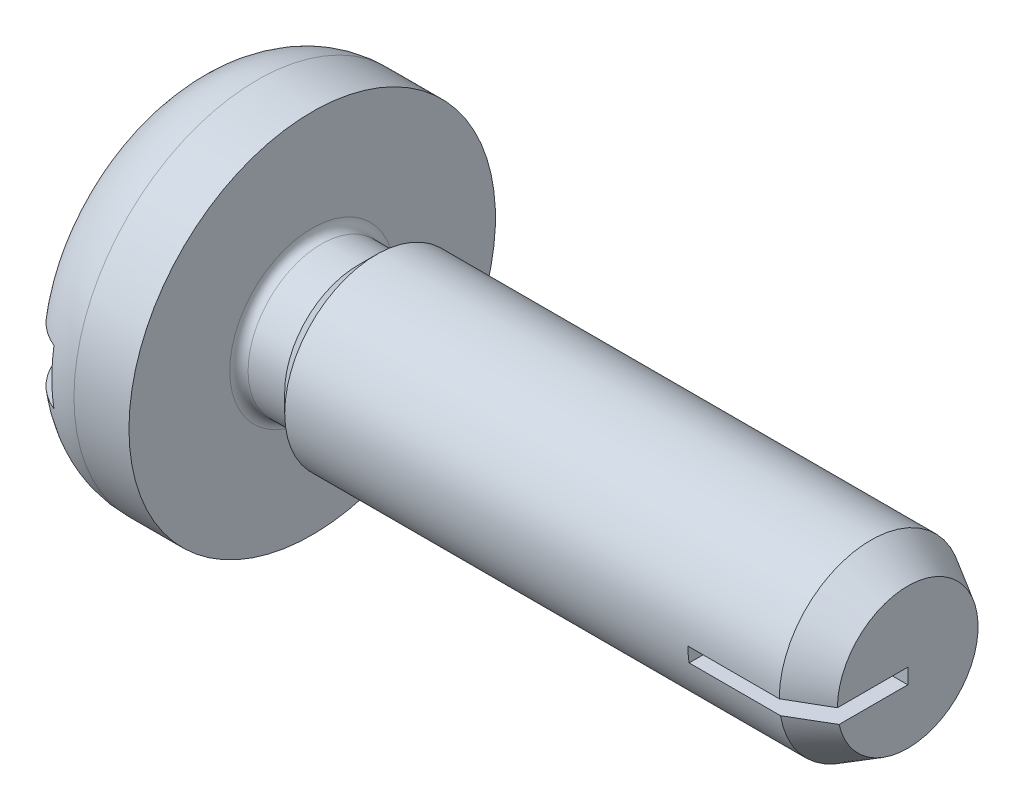
ISO-10303-21;
HEADER;
FILE_DESCRIPTION(('STEP AP214'),'2;1');
FILE_NAME('part.step','',(''),(''),'','','');
FILE_SCHEMA(('AUTOMOTIVE_DESIGN { 1 0 10303 214 1 1 1 1 }'));
ENDSEC;
DATA;
#1=APPLICATION_CONTEXT('core data for automotive mechanical design processes');
#2=APPLICATION_PROTOCOL_DEFINITION('international standard','automotive_design',2000,#1);
#3=PRODUCT_CONTEXT('',#1,'mechanical');
#4=PRODUCT('Part','Part','',(#3));
#5=PRODUCT_RELATED_PRODUCT_CATEGORY('part','',(#4));
#6=PRODUCT_DEFINITION_FORMATION('','',#4);
#7=PRODUCT_DEFINITION_CONTEXT('part definition',#1,'design');
#8=PRODUCT_DEFINITION('design','',#6,#7);
#9=PRODUCT_DEFINITION_SHAPE('','',#8);
#10=(LENGTH_UNIT() NAMED_UNIT(*) SI_UNIT(.MILLI.,.METRE.));
#11=(NAMED_UNIT(*) PLANE_ANGLE_UNIT() SI_UNIT($,.RADIAN.));
#12=(NAMED_UNIT(*) SI_UNIT($,.STERADIAN.) SOLID_ANGLE_UNIT());
#13=UNCERTAINTY_MEASURE_WITH_UNIT(LENGTH_MEASURE(1.E-05),#10,'distance_accuracy_value','');
#14=(GEOMETRIC_REPRESENTATION_CONTEXT(3) GLOBAL_UNCERTAINTY_ASSIGNED_CONTEXT((#13)) GLOBAL_UNIT_ASSIGNED_CONTEXT((#10,
#11,#12)) REPRESENTATION_CONTEXT('',''));
#15=CARTESIAN_POINT('',(0.,0.,0.));
#16=DIRECTION('',(0.,0.,1.));
#17=DIRECTION('',(1.,0.,0.));
#18=AXIS2_PLACEMENT_3D('',#15,#16,#17);
#19=CARTESIAN_POINT('',(0.,0.,0.));
#20=DIRECTION('',(-1.,0.,0.));
#21=DIRECTION('',(0.,0.,1.));
#22=AXIS2_PLACEMENT_3D('',#19,#20,#21);
#23=CYLINDRICAL_SURFACE('',#22,2.);
#24=CARTESIAN_POINT('',(4.2,0.,0.));
#25=DIRECTION('',(-1.,0.,0.));
#26=DIRECTION('',(0.,0.,1.));
#27=AXIS2_PLACEMENT_3D('',#24,#25,#26);
#28=CIRCLE('',#27,2.);
#29=CARTESIAN_POINT('',(4.2,0.,2.));
#30=VERTEX_POINT('',#29);
#31=EDGE_CURVE('E191',#30,#30,#28,.T.);
#32=ORIENTED_EDGE('',*,*,#31,.F.);
#33=EDGE_LOOP('',(#32));
#34=FACE_BOUND('',#33,.T.);
#35=DIRECTION('',(-1.,0.,0.));
#36=VECTOR('',#35,1.);
#37=CARTESIAN_POINT('',(0.,0.,2.));
#38=LINE('',#37,#36);
#39=CARTESIAN_POINT('',(14.9945963744805,0.,2.));
#40=VERTEX_POINT('',#39);
#41=CARTESIAN_POINT('',(13.,0.,2.));
#42=VERTEX_POINT('',#41);
#43=EDGE_CURVE('E291',#40,#42,#38,.T.);
#44=ORIENTED_EDGE('',*,*,#43,.F.);
#45=CARTESIAN_POINT('',(14.9945963744805,0.,0.));
#46=DIRECTION('',(-1.,0.,0.));
#47=DIRECTION('',(0.,0.,1.));
#48=AXIS2_PLACEMENT_3D('',#45,#46,#47);
#49=CIRCLE('',#48,2.);
#50=CARTESIAN_POINT('',(14.9945963744805,-0.333333333333,1.9720265943666));
#51=VERTEX_POINT('',#50);
#52=EDGE_CURVE('E287',#40,#51,#49,.T.);
#53=ORIENTED_EDGE('',*,*,#52,.T.);
#54=DIRECTION('',(-1.,0.,0.));
#55=VECTOR('',#54,1.);
#56=CARTESIAN_POINT('',(0.,-0.333333333333002,1.97202659436659));
#57=LINE('',#56,#55);
#58=CARTESIAN_POINT('',(13.,-0.333333333333,1.97202659436659));
#59=VERTEX_POINT('',#58);
#60=EDGE_CURVE('E297',#59,#51,#57,.F.);
#61=ORIENTED_EDGE('',*,*,#60,.F.);
#62=CARTESIAN_POINT('',(13.,0.,0.));
#63=DIRECTION('',(1.,0.,0.));
#64=DIRECTION('',(0.,0.,-1.));
#65=AXIS2_PLACEMENT_3D('',#62,#63,#64);
#66=CIRCLE('',#65,2.);
#67=EDGE_CURVE('E52',#42,#59,#66,.T.);
#68=ORIENTED_EDGE('',*,*,#67,.F.);
#69=EDGE_LOOP('',(#44,#53,#61,#68));
#70=FACE_BOUND('',#69,.T.);
#71=ADVANCED_FACE('F81',(#34,#70),#23,.T.);
#72=CARTESIAN_POINT('',(14.9945963744805,0.,0.));
#73=DIRECTION('',(-1.,0.,0.));
#74=DIRECTION('',(0.,0.,1.));
#75=AXIS2_PLACEMENT_3D('',#72,#73,#74);
#76=CONICAL_SURFACE('',#75,2.,0.523598775598292);
#77=ORIENTED_EDGE('',*,*,#52,.F.);
#78=DIRECTION('',(-0.866025403784442,0.,0.499999999999994));
#79=VECTOR('',#78,1.);
#80=CARTESIAN_POINT('',(18.4586979896183,0.,0.));
#81=LINE('',#80,#79);
#82=CARTESIAN_POINT('',(15.8,0.,1.535));
#83=VERTEX_POINT('',#82);
#84=EDGE_CURVE('E294',#40,#83,#81,.F.);
#85=ORIENTED_EDGE('',*,*,#84,.T.);
#86=CARTESIAN_POINT('',(15.8,0.,0.));
#87=DIRECTION('',(-1.,0.,0.));
#88=DIRECTION('',(0.,0.,1.));
#89=AXIS2_PLACEMENT_3D('',#86,#87,#88);
#90=CIRCLE('',#89,1.535);
#91=CARTESIAN_POINT('',(15.8,-0.333333333333,1.49837041110972));
#92=VERTEX_POINT('',#91);
#93=EDGE_CURVE('E173',#83,#92,#90,.T.);
#94=ORIENTED_EDGE('',*,*,#93,.T.);
#95=CARTESIAN_POINT('',(17.5245765824783,-0.333333333333,0.423969130143713));
#96=CARTESIAN_POINT('',(17.5003740457096,-0.333333333333,0.441731979885224));
#97=CARTESIAN_POINT('',(17.4759825511919,-0.333333333333,0.459232622890745));
#98=CARTESIAN_POINT('',(17.4269078263049,-0.333333333333,0.493815030613649));
#99=CARTESIAN_POINT('',(17.4022246273064,-0.333333333333,0.510896839777153));
#100=CARTESIAN_POINT('',(17.3278722925053,-0.333333333333,0.561668721062156));
#101=CARTESIAN_POINT('',(17.2778872579112,-0.333333333333,0.594894723858103));
#102=CARTESIAN_POINT('',(17.1774348727686,-0.333333333333,0.660556630402382));
#103=CARTESIAN_POINT('',(17.1269677359498,-0.333333333333,0.69299286353038));
#104=CARTESIAN_POINT('',(17.0256954006843,-0.333333333333,0.757342083018887));
#105=CARTESIAN_POINT('',(16.9748901731657,-0.333333333333,0.789255023543246));
#106=CARTESIAN_POINT('',(16.8279577740193,-0.333333333333,0.880817693719269));
#107=CARTESIAN_POINT('',(16.7315407131426,-0.333333333333,0.940001352859358));
#108=CARTESIAN_POINT('',(16.5382584243443,-0.333333333333,1.05763303057236));
#109=CARTESIAN_POINT('',(16.441393187678,-0.333333333333,1.1160810347079));
#110=CARTESIAN_POINT('',(16.1503178331719,-0.333333333333,1.29078741345157));
#111=CARTESIAN_POINT('',(15.9556992156579,-0.333333333333,1.40636454218399));
#112=CARTESIAN_POINT('',(15.6117855109858,-0.333333333333,1.60961313435387));
#113=CARTESIAN_POINT('',(15.4625918069533,-0.333333333333,1.69745704925354));
#114=CARTESIAN_POINT('',(15.1640150959636,-0.333333333333,1.87282276563441));
#115=CARTESIAN_POINT('',(15.0146320890848,-0.333333333333,1.96034456724917));
#116=CARTESIAN_POINT('',(14.7158541084658,-0.333333333333,2.13511384760564));
#117=CARTESIAN_POINT('',(14.5664592252995,-0.333333333333,2.22236148136738));
#118=CARTESIAN_POINT('',(14.267580965648,-0.333333333333,2.39670435015643));
#119=CARTESIAN_POINT('',(14.118097589348,-0.333333333333,2.48379958550107));
#120=CARTESIAN_POINT('',(13.9685865686968,-0.333333333333,2.57084728179613));
#121=B_SPLINE_CURVE_WITH_KNOTS('',3,(#95,#96,#97,#98,#99,#100,#101,#102,#103,#104,#105,#106,
#107,#108,#109,#110,#111,#112,#113,#114,#115,#116,#117,#118,#119,#120),.UNSPECIFIED.,.F.,.F.,(4,
2,2,2,2,2,2,2,2,2,2,2,4),(0.,0.0900582312371365,0.180106863879635,0.360155492791983,
0.540127698161662,0.720115584310064,1.05950608853913,1.39890324302167,2.07794788471719,
2.59734938198932,3.11675066387125,3.63576777514388,4.15478380441619),.UNSPECIFIED.);
#122=EDGE_CURVE('E300',#92,#51,#121,.T.);
#123=ORIENTED_EDGE('',*,*,#122,.T.);
#124=EDGE_LOOP('',(#77,#85,#94,#123));
#125=FACE_BOUND('',#124,.T.);
#126=ADVANCED_FACE('F246',(#125),#76,.T.);
#127=CARTESIAN_POINT('',(15.8,2.,0.));
#128=DIRECTION('',(-1.,0.,0.));
#129=DIRECTION('',(0.,0.,1.));
#130=AXIS2_PLACEMENT_3D('',#127,#128,#129);
#131=PLANE('',#130);
#132=DIRECTION('',(0.,0.,1.));
#133=VECTOR('',#132,1.);
#134=CARTESIAN_POINT('',(15.8,0.,0.));
#135=LINE('',#134,#133);
#136=CARTESIAN_POINT('',(15.8,0.,0.));
#137=VERTEX_POINT('',#136);
#138=EDGE_CURVE('E90',#137,#83,#135,.T.);
#139=ORIENTED_EDGE('',*,*,#138,.F.);
#140=DIRECTION('',(0.,1.,0.));
#141=VECTOR('',#140,1.);
#142=CARTESIAN_POINT('',(15.8,0.,0.));
#143=LINE('',#142,#141);
#144=CARTESIAN_POINT('',(15.8,-0.333333333333,0.));
#145=VERTEX_POINT('',#144);
#146=EDGE_CURVE('E163',#145,#137,#143,.T.);
#147=ORIENTED_EDGE('',*,*,#146,.F.);
#148=DIRECTION('',(0.,0.,-1.));
#149=VECTOR('',#148,1.);
#150=CARTESIAN_POINT('',(15.8,-0.333333333333,0.));
#151=LINE('',#150,#149);
#152=EDGE_CURVE('E175',#92,#145,#151,.T.);
#153=ORIENTED_EDGE('',*,*,#152,.F.);
#154=ORIENTED_EDGE('',*,*,#93,.F.);
#155=EDGE_LOOP('',(#139,#147,#153,#154));
#156=FACE_BOUND('',#155,.T.);
#157=ADVANCED_FACE('F83',(#156),#131,.F.);
#158=CARTESIAN_POINT('',(0.,0.,0.));
#159=DIRECTION('',(1.,0.,0.));
#160=DIRECTION('',(0.,0.,-1.));
#161=AXIS2_PLACEMENT_3D('',#158,#159,#160);
#162=PLANE('',#161);
#163=CARTESIAN_POINT('',(0.,0.,0.));
#164=DIRECTION('',(-1.,0.,0.));
#165=DIRECTION('',(0.,0.,1.));
#166=AXIS2_PLACEMENT_3D('',#163,#164,#165);
#167=CIRCLE('',#166,2.4);
#168=CARTESIAN_POINT('',(0.,0.6,2.32379000772445));
#169=VERTEX_POINT('',#168);
#170=CARTESIAN_POINT('',(0.,0.6,-2.32379000772445));
#171=VERTEX_POINT('',#170);
#172=EDGE_CURVE('E215',#169,#171,#167,.T.);
#173=ORIENTED_EDGE('',*,*,#172,.T.);
#174=DIRECTION('',(0.,0.,1.));
#175=VECTOR('',#174,1.);
#176=CARTESIAN_POINT('',(0.,0.6,0.));
#177=LINE('',#176,#175);
#178=EDGE_CURVE('E184',#171,#169,#177,.T.);
#179=ORIENTED_EDGE('',*,*,#178,.T.);
#180=EDGE_LOOP('',(#173,#179));
#181=FACE_BOUND('',#180,.T.);
#182=ADVANCED_FACE('F334',(#181),#162,.F.);
#183=CARTESIAN_POINT('',(4.2,0.,0.));
#184=DIRECTION('',(1.,0.,0.));
#185=DIRECTION('',(0.,0.,-1.));
#186=AXIS2_PLACEMENT_3D('',#183,#184,#185);
#187=CONICAL_SURFACE('',#186,2.,0.78539816339745);
#188=CARTESIAN_POINT('',(3.8,0.,0.));
#189=DIRECTION('',(-1.,0.,0.));
#190=DIRECTION('',(0.,0.,1.));
#191=AXIS2_PLACEMENT_3D('',#188,#189,#190);
#192=CIRCLE('',#191,1.6);
#193=CARTESIAN_POINT('',(3.8,0.,1.6));
#194=VERTEX_POINT('',#193);
#195=EDGE_CURVE('E195',#194,#194,#192,.T.);
#196=ORIENTED_EDGE('',*,*,#195,.F.);
#197=EDGE_LOOP('',(#196));
#198=FACE_BOUND('',#197,.T.);
#199=ORIENTED_EDGE('',*,*,#31,.T.);
#200=EDGE_LOOP('',(#199));
#201=FACE_BOUND('',#200,.T.);
#202=ADVANCED_FACE('F330',(#198,#201),#187,.T.);
#203=CARTESIAN_POINT('',(0.,0.,0.));
#204=DIRECTION('',(-1.,0.,0.));
#205=DIRECTION('',(0.,0.,1.));
#206=AXIS2_PLACEMENT_3D('',#203,#204,#205);
#207=CYLINDRICAL_SURFACE('',#206,1.6);
#208=CARTESIAN_POINT('',(3.,0.,0.));
#209=DIRECTION('',(-1.,0.,0.));
#210=DIRECTION('',(0.,0.,1.));
#211=AXIS2_PLACEMENT_3D('',#208,#209,#210);
#212=CIRCLE('',#211,1.6);
#213=CARTESIAN_POINT('',(3.,0.,1.6));
#214=VERTEX_POINT('',#213);
#215=EDGE_CURVE('E199',#214,#214,#212,.T.);
#216=ORIENTED_EDGE('',*,*,#215,.F.);
#217=EDGE_LOOP('',(#216));
#218=FACE_BOUND('',#217,.T.);
#219=ORIENTED_EDGE('',*,*,#195,.T.);
#220=EDGE_LOOP('',(#219));
#221=FACE_BOUND('',#220,.T.);
#222=ADVANCED_FACE('F333',(#218,#221),#207,.T.);
#223=CARTESIAN_POINT('',(3.,0.,0.));
#224=DIRECTION('',(-1.,0.,0.));
#225=DIRECTION('',(0.,0.,1.));
#226=AXIS2_PLACEMENT_3D('',#223,#224,#225);
#227=TOROIDAL_SURFACE('',#226,1.8,0.2);
#228=CARTESIAN_POINT('',(2.8,0.,0.));
#229=DIRECTION('',(-1.,0.,0.));
#230=DIRECTION('',(0.,0.,1.));
#231=AXIS2_PLACEMENT_3D('',#228,#229,#230);
#232=CIRCLE('',#231,1.8);
#233=CARTESIAN_POINT('',(2.8,0.,1.8));
#234=VERTEX_POINT('',#233);
#235=EDGE_CURVE('E203',#234,#234,#232,.T.);
#236=ORIENTED_EDGE('',*,*,#235,.F.);
#237=EDGE_LOOP('',(#236));
#238=FACE_BOUND('',#237,.T.);
#239=ORIENTED_EDGE('',*,*,#215,.T.);
#240=EDGE_LOOP('',(#239));
#241=FACE_BOUND('',#240,.T.);
#242=ADVANCED_FACE('F338',(#238,#241),#227,.F.);
#243=CARTESIAN_POINT('',(2.8,4.,0.));
#244=DIRECTION('',(-1.,0.,0.));
#245=DIRECTION('',(0.,0.,1.));
#246=AXIS2_PLACEMENT_3D('',#243,#244,#245);
#247=PLANE('',#246);
#248=CARTESIAN_POINT('',(2.8,0.,0.));
#249=DIRECTION('',(-1.,0.,0.));
#250=DIRECTION('',(0.,0.,1.));
#251=AXIS2_PLACEMENT_3D('',#248,#249,#250);
#252=CIRCLE('',#251,4.);
#253=CARTESIAN_POINT('',(2.8,0.,4.));
#254=VERTEX_POINT('',#253);
#255=EDGE_CURVE('E207',#254,#254,#252,.T.);
#256=ORIENTED_EDGE('',*,*,#255,.F.);
#257=EDGE_LOOP('',(#256));
#258=FACE_BOUND('',#257,.T.);
#259=ORIENTED_EDGE('',*,*,#235,.T.);
#260=EDGE_LOOP('',(#259));
#261=FACE_BOUND('',#260,.T.);
#262=ADVANCED_FACE('F342',(#258,#261),#247,.F.);
#263=CARTESIAN_POINT('',(0.,0.,0.));
#264=DIRECTION('',(-1.,0.,0.));
#265=DIRECTION('',(0.,0.,1.));
#266=AXIS2_PLACEMENT_3D('',#263,#264,#265);
#267=CYLINDRICAL_SURFACE('',#266,4.);
#268=CARTESIAN_POINT('',(1.6,0.,0.));
#269=DIRECTION('',(-1.,0.,0.));
#270=DIRECTION('',(0.,0.,1.));
#271=AXIS2_PLACEMENT_3D('',#268,#269,#270);
#272=CIRCLE('',#271,4.);
#273=CARTESIAN_POINT('',(1.6,0.,4.));
#274=VERTEX_POINT('',#273);
#275=EDGE_CURVE('E211',#274,#274,#272,.T.);
#276=ORIENTED_EDGE('',*,*,#275,.F.);
#277=EDGE_LOOP('',(#276));
#278=FACE_BOUND('',#277,.T.);
#279=ORIENTED_EDGE('',*,*,#255,.T.);
#280=EDGE_LOOP('',(#279));
#281=FACE_BOUND('',#280,.T.);
#282=ADVANCED_FACE('F345',(#278,#281),#267,.T.);
#283=CARTESIAN_POINT('',(1.6,0.,0.));
#284=DIRECTION('',(-1.,0.,0.));
#285=DIRECTION('',(0.,0.,1.));
#286=AXIS2_PLACEMENT_3D('',#283,#284,#285);
#287=TOROIDAL_SURFACE('',#286,2.4,1.6);
#288=CARTESIAN_POINT('',(1.,0.,0.));
#289=DIRECTION('',(1.,0.,0.));
#290=DIRECTION('',(0.,0.,-1.));
#291=AXIS2_PLACEMENT_3D('',#288,#289,#290);
#292=CIRCLE('',#291,3.88323969741913);
#293=CARTESIAN_POINT('',(1.,-0.6,-3.83660664488971));
#294=VERTEX_POINT('',#293);
#295=CARTESIAN_POINT('',(1.,0.6,-3.8366066448897));
#296=VERTEX_POINT('',#295);
#297=EDGE_CURVE('E177',#294,#296,#292,.T.);
#298=ORIENTED_EDGE('',*,*,#297,.T.);
#299=CARTESIAN_POINT('',(0.654809845010151,0.6,-3.64188054931344));
#300=CARTESIAN_POINT('',(0.58199078209755,0.6,-3.58784518384716));
#301=CARTESIAN_POINT('',(0.513775760616522,0.6,-3.52757930403024));
#302=CARTESIAN_POINT('',(0.388481317733719,0.6,-3.39639398820466));
#303=CARTESIAN_POINT('',(0.331405350961172,0.6,-3.3254712591483));
#304=CARTESIAN_POINT('',(0.229973701084003,0.6,-3.17513392204832));
#305=CARTESIAN_POINT('',(0.185608306433043,0.6,-3.09572586128253));
#306=CARTESIAN_POINT('',(0.110644665428382,0.6,-2.93067426739628));
#307=CARTESIAN_POINT('',(0.0800458014458085,0.6,-2.84503101421512));
#308=CARTESIAN_POINT('',(0.0329384058216036,0.6,-2.66871059015871));
#309=CARTESIAN_POINT('',(0.0166272721060895,0.6,-2.57798077867755));
#310=CARTESIAN_POINT('',(-0.00100669609223097,0.6,-2.39508446991405));
#311=CARTESIAN_POINT('',(-0.00232761738429422,0.6,-2.30291779074841));
#312=CARTESIAN_POINT('',(0.00991949604729926,0.6,-2.11675841339519));
#313=CARTESIAN_POINT('',(0.0239437197443465,0.6,-2.02279597477395));
#314=CARTESIAN_POINT('',(0.0668082108658002,0.6,-1.8383403158996));
#315=CARTESIAN_POINT('',(0.0956497196064377,0.6,-1.74784738698691));
#316=CARTESIAN_POINT('',(0.168743616691862,0.6,-1.5680251206165));
#317=CARTESIAN_POINT('',(0.213694193245931,0.6,-1.47897998964826));
#318=CARTESIAN_POINT('',(0.316918981671748,0.6,-1.30897418951555));
#319=CARTESIAN_POINT('',(0.375201578023294,0.6,-1.2280186541126));
#320=CARTESIAN_POINT('',(0.508057564603522,0.6,-1.07011325865286));
#321=CARTESIAN_POINT('',(0.58351776277415,0.6,-0.993904059276813));
#322=CARTESIAN_POINT('',(0.705084226554184,0.6,-0.889452989931));
#323=CARTESIAN_POINT('',(0.74703444425851,0.6,-0.85626014671737));
#324=CARTESIAN_POINT('',(0.833550930476259,0.6,-0.793490340147614));
#325=CARTESIAN_POINT('',(0.878116345641084,0.6,-0.763912206902763));
#326=CARTESIAN_POINT('',(0.988913028847367,0.6,-0.697267369258276));
#327=CARTESIAN_POINT('',(1.05640186285814,0.6,-0.662251833273793));
#328=CARTESIAN_POINT('',(1.19577579162676,0.6,-0.602703229584992));
#329=CARTESIAN_POINT('',(1.26764792022765,0.6,-0.578140810880208));
#330=CARTESIAN_POINT('',(1.40140437554177,0.6,-0.546051317392345));
#331=CARTESIAN_POINT('',(1.46272297496946,0.6,-0.536236008625733));
#332=CARTESIAN_POINT('',(1.58609581896232,0.6,-0.527458968927674));
#333=CARTESIAN_POINT('',(1.64814895503571,0.6,-0.528482560103624));
#334=CARTESIAN_POINT('',(1.77089868771172,0.6,-0.541132086945187));
#335=CARTESIAN_POINT('',(1.83159906136542,0.6,-0.552723289590556));
#336=CARTESIAN_POINT('',(1.95071813039844,0.6,-0.584742595093748));
#337=CARTESIAN_POINT('',(2.00913009435895,0.6,-0.605194904244826));
#338=CARTESIAN_POINT('',(2.11099214671504,0.6,-0.648052758355643));
#339=CARTESIAN_POINT('',(2.15500893279104,0.6,-0.669146916791023));
#340=CARTESIAN_POINT('',(2.24107296493663,0.6,-0.715049337791325));
#341=CARTESIAN_POINT('',(2.28311918892453,0.6,-0.739859500367252));
#342=CARTESIAN_POINT('',(2.40618508406826,0.6,-0.819175370787809));
#343=CARTESIAN_POINT('',(2.48410994183156,0.6,-0.878556728375155));
#344=CARTESIAN_POINT('',(2.63254844432416,0.6,-1.00993199155866));
#345=CARTESIAN_POINT('',(2.70277745836939,0.6,-1.08224491184962));
#346=CARTESIAN_POINT('',(2.83138975083911,0.6,-1.23667501794966));
#347=CARTESIAN_POINT('',(2.88978169589052,0.6,-1.31878496028792));
#348=CARTESIAN_POINT('',(2.99809354046192,0.6,-1.49991584324517));
#349=CARTESIAN_POINT('',(3.04657246530278,0.6,-1.59980700341959));
#350=CARTESIAN_POINT('',(3.12464055960414,0.6,-1.80678580328812));
#351=CARTESIAN_POINT('',(3.15422748781702,0.6,-1.913874295171));
#352=CARTESIAN_POINT('',(3.19138227389968,0.6,-2.12405715809966));
#353=CARTESIAN_POINT('',(3.20035067381238,0.6,-2.22690380361223));
#354=CARTESIAN_POINT('',(3.19962875295243,0.6,-2.43252670826006));
#355=CARTESIAN_POINT('',(3.18994736799003,0.6,-2.53530297751264));
#356=CARTESIAN_POINT('',(3.15309107843355,0.6,-2.73082849460489));
#357=CARTESIAN_POINT('',(3.12707913008532,0.6,-2.82379787566324));
#358=CARTESIAN_POINT('',(3.05920522453294,0.6,-3.00376251394678));
#359=CARTESIAN_POINT('',(3.01734688599343,0.6,-3.09075912975204));
#360=CARTESIAN_POINT('',(2.9207697692297,0.6,-3.25285743526713));
#361=CARTESIAN_POINT('',(2.86659573522414,0.6,-3.32828405371569));
#362=CARTESIAN_POINT('',(2.74610076429378,0.6,-3.4687166204034));
#363=CARTESIAN_POINT('',(2.67978143676393,0.6,-3.53372394718416));
#364=CARTESIAN_POINT('',(2.53842528558232,0.6,-3.65005317951425));
#365=CARTESIAN_POINT('',(2.46360296025386,0.6,-3.70163588613821));
#366=CARTESIAN_POINT('',(2.30628037405303,0.6,-3.79133472290781));
#367=CARTESIAN_POINT('',(2.22378071377411,0.6,-3.82945190533658));
#368=CARTESIAN_POINT('',(2.05447983469296,0.6,-3.89070734559752));
#369=CARTESIAN_POINT('',(1.96773947548818,0.6,-3.91401391315029));
#370=CARTESIAN_POINT('',(1.79156479726121,0.6,-3.94564939926133));
#371=CARTESIAN_POINT('',(1.7021304438921,0.6,-3.95397812677824));
#372=CARTESIAN_POINT('',(1.5236034652896,0.6,-3.95540521781013));
#373=CARTESIAN_POINT('',(1.43451144333315,0.6,-3.94858156505499));
#374=CARTESIAN_POINT('',(1.25875745190974,0.6,-3.92006594498559));
#375=CARTESIAN_POINT('',(1.17209483427131,0.6,-3.89837798357376));
#376=CARTESIAN_POINT('',(1.01040022212285,0.6,-3.84309899013402));
#377=CARTESIAN_POINT('',(0.934992553844654,0.6,-3.81059993529235));
#378=CARTESIAN_POINT('',(0.790075004583661,0.6,-3.73438784787714));
#379=CARTESIAN_POINT('',(0.720565342999594,0.6,-3.69067439838482));
#380=CARTESIAN_POINT('',(0.654809845010151,0.6,-3.64188054931344));
#381=B_SPLINE_CURVE_WITH_KNOTS('',3,(#299,#300,#301,#302,#303,#304,#305,#306,#307,#308,#309,
#310,#311,#312,#313,#314,#315,#316,#317,#318,#319,#320,#321,#322,#323,#324,#325,#326,#327,#328,
#329,#330,#331,#332,#333,#334,#335,#336,#337,#338,#339,#340,#341,#342,#343,#344,#345,#346,#347,
#348,#349,#350,#351,#352,#353,#354,#355,#356,#357,#358,#359,#360,#361,#362,#363,#364,#365,#366,
#367,#368,#369,#370,#371,#372,#373,#374,#375,#376,#377,#378,#379,#380),.UNSPECIFIED.,.T.,.F.,(4,
2,2,2,2,2,2,2,2,2,2,2,2,2,2,2,2,2,2,2,2,2,2,2,2,2,2,2,2,2,2,2,2,2,2,2,2,2,2,2,4),(0.,
0.271735693827478,0.543555529396883,0.815167123027897,1.08676652971805,1.36206168746092,
1.63739198054476,1.92113542662961,2.20490264716385,2.50285252046958,2.80099029152631,
3.12120756210859,3.28153894297461,3.44181829492809,3.66921866596691,3.89597624460537,
4.08142450981482,4.26662167562765,4.45121233183553,4.63631045404306,4.78255096090636,
4.92886649813669,5.22156900207711,5.522861966869,5.82393353391279,6.15525923061269,
6.48662422676038,6.79471610608199,7.10266040376397,7.39083518535747,7.67894419932447,
7.95618407835509,8.23338724637213,8.50471657220387,8.77602468991495,9.0441917303625,
9.31236219123882,9.57915567781745,9.84587729232521,10.0912450682615,10.3366219675849),.UNSPECIFIED.);
#382=EDGE_CURVE('E220',#296,#171,#381,.T.);
#383=ORIENTED_EDGE('',*,*,#382,.T.);
#384=ORIENTED_EDGE('',*,*,#172,.F.);
#385=CARTESIAN_POINT('',(1.14014500172989,0.6,0.62655342609684));
#386=CARTESIAN_POINT('',(1.09624219881501,0.6,0.644793472981441));
#387=CARTESIAN_POINT('',(1.0532288439098,0.6,0.665121885635545));
#388=CARTESIAN_POINT('',(0.969065837067668,0.6,0.709346041544249));
#389=CARTESIAN_POINT('',(0.927917137769486,0.6,0.733243582045045));
#390=CARTESIAN_POINT('',(0.807359311940052,0.6,0.809640485864823));
#391=CARTESIAN_POINT('',(0.730877822018529,0.6,0.866826969936164));
#392=CARTESIAN_POINT('',(0.583343518779677,0.6,0.99457850447861));
#393=CARTESIAN_POINT('',(0.512745599524827,0.6,1.0656649451986));
#394=CARTESIAN_POINT('',(0.38310874214301,0.6,1.21763976804169));
#395=CARTESIAN_POINT('',(0.324062205775341,0.6,1.29852164986157));
#396=CARTESIAN_POINT('',(0.213604102942159,0.6,1.47783509042699));
#397=CARTESIAN_POINT('',(0.163722327807914,0.6,1.57721861923491));
#398=CARTESIAN_POINT('',(0.0827482462277977,0.6,1.78343378051659));
#399=CARTESIAN_POINT('',(0.0516579559789274,0.6,1.89026621083516));
#400=CARTESIAN_POINT('',(0.0115309990969026,0.6,2.10039056540426));
#401=CARTESIAN_POINT('',(0.00112460990975324,0.6,2.20342064434325));
#402=CARTESIAN_POINT('',(-0.000950397603466354,0.6,2.40966555932261));
#403=CARTESIAN_POINT('',(0.00737209892707302,0.6,2.51288028455258));
#404=CARTESIAN_POINT('',(0.041709681541876,0.6,2.70937341448454));
#405=CARTESIAN_POINT('',(0.0665348082135512,0.6,2.80286070507645));
#406=CARTESIAN_POINT('',(0.132157604733277,0.6,2.98405392772781));
#407=CARTESIAN_POINT('',(0.172951491869275,0.6,3.07176122321964));
#408=CARTESIAN_POINT('',(0.267556104597236,0.6,3.23534818539897));
#409=CARTESIAN_POINT('',(0.320804527009934,0.6,3.31155342758057));
#410=CARTESIAN_POINT('',(0.439601472630512,0.6,3.45368504752007));
#411=CARTESIAN_POINT('',(0.505148340968001,0.6,3.51961280602642));
#412=CARTESIAN_POINT('',(0.645117642583022,0.6,3.63784511189877));
#413=CARTESIAN_POINT('',(0.719317101936818,0.6,3.69041378696717));
#414=CARTESIAN_POINT('',(0.875573068015419,0.6,3.78217217254545));
#415=CARTESIAN_POINT('',(0.957628994771025,0.6,3.82136286965224));
#416=CARTESIAN_POINT('',(1.12621540453287,0.6,3.88479783291086));
#417=CARTESIAN_POINT('',(1.21268139766383,0.6,3.90921358846108));
#418=CARTESIAN_POINT('',(1.38849418749768,0.6,3.94309371530648));
#419=CARTESIAN_POINT('',(1.47784087685397,0.6,3.95255864307543));
#420=CARTESIAN_POINT('',(1.65635960179844,0.6,3.95624505591505));
#421=CARTESIAN_POINT('',(1.74552994251536,0.6,3.95054920225186));
#422=CARTESIAN_POINT('',(1.92164522461057,0.6,3.92425905890293));
#423=CARTESIAN_POINT('',(2.00859019374824,0.6,3.90366495515253));
#424=CARTESIAN_POINT('',(2.17775253327743,0.6,3.84819982952237));
#425=CARTESIAN_POINT('',(2.25997211747092,0.6,3.81333555630716));
#426=CARTESIAN_POINT('',(2.41742427724615,0.6,3.73035504791079));
#427=CARTESIAN_POINT('',(2.49265679361338,0.6,3.6822387004337));
#428=CARTESIAN_POINT('',(2.63436653857681,0.6,3.5739220399947));
#429=CARTESIAN_POINT('',(2.70080450755379,0.6,3.51367038163202));
#430=CARTESIAN_POINT('',(2.82274123246984,0.6,3.38296733801993));
#431=CARTESIAN_POINT('',(2.8782396315985,0.6,3.31251562021031));
#432=CARTESIAN_POINT('',(2.97735432928007,0.6,3.16267658298415));
#433=CARTESIAN_POINT('',(3.0208452380622,0.6,3.08320636307012));
#434=CARTESIAN_POINT('',(3.09413101153958,0.6,2.91819184654387));
#435=CARTESIAN_POINT('',(3.12392516452018,0.6,2.83264723455897));
#436=CARTESIAN_POINT('',(3.16961155230951,0.6,2.65626578287315));
#437=CARTESIAN_POINT('',(3.18524099295917,0.6,2.56536097347669));
#438=CARTESIAN_POINT('',(3.20149690366373,0.6,2.3822284401593));
#439=CARTESIAN_POINT('',(3.20212141839231,0.6,2.29000054539096));
#440=CARTESIAN_POINT('',(3.18846557695144,0.6,2.10379961649388));
#441=CARTESIAN_POINT('',(3.17372440233769,0.6,2.00986062818103));
#442=CARTESIAN_POINT('',(3.12944739543503,0.6,1.82556493627771));
#443=CARTESIAN_POINT('',(3.09991051160248,0.6,1.73520848779401));
#444=CARTESIAN_POINT('',(3.02541323455614,0.6,1.55572172191261));
#445=CARTESIAN_POINT('',(2.97974909764013,0.6,1.46688390790555));
#446=CARTESIAN_POINT('',(2.87514145377819,0.6,1.29739289303719));
#447=CARTESIAN_POINT('',(2.81618890290842,0.6,1.21674532082777));
#448=CARTESIAN_POINT('',(2.68196946257801,0.6,1.05954648888853));
#449=CARTESIAN_POINT('',(2.6058144753479,0.6,0.98374776392515));
#450=CARTESIAN_POINT('',(2.48323959578703,0.6,0.880027655389768));
#451=CARTESIAN_POINT('',(2.44096008547891,0.6,0.847098759103832));
#452=CARTESIAN_POINT('',(2.35379295344663,0.6,0.784907441810262));
#453=CARTESIAN_POINT('',(2.30890623215104,0.6,0.75564376587048));
#454=CARTESIAN_POINT('',(2.19819007850428,0.6,0.690348999077872));
#455=CARTESIAN_POINT('',(2.13116995777451,0.6,0.65629815565627));
#456=CARTESIAN_POINT('',(1.9928717681322,0.6,0.598612360765352));
#457=CARTESIAN_POINT('',(1.92160658964292,0.6,0.574947536345721));
#458=CARTESIAN_POINT('',(1.78851055211543,0.6,0.544219821879509));
#459=CARTESIAN_POINT('',(1.72719705122854,0.6,0.534983961265749));
#460=CARTESIAN_POINT('',(1.60392919223036,0.6,0.527375611189938));
#461=CARTESIAN_POINT('',(1.54197567852883,0.6,0.528990276828255));
#462=CARTESIAN_POINT('',(1.42214306644754,0.6,0.542425046965623));
#463=CARTESIAN_POINT('',(1.36420770870913,0.6,0.553771838731919));
#464=CARTESIAN_POINT('',(1.25043691453205,0.6,0.58451341272546));
#465=CARTESIAN_POINT('',(1.19460659475993,0.6,0.603926578963552));
#466=CARTESIAN_POINT('',(1.14014500172989,0.6,0.62655342609684));
#467=B_SPLINE_CURVE_WITH_KNOTS('',3,(#385,#386,#387,#388,#389,#390,#391,#392,#393,#394,#395,
#396,#397,#398,#399,#400,#401,#402,#403,#404,#405,#406,#407,#408,#409,#410,#411,#412,#413,#414,
#415,#416,#417,#418,#419,#420,#421,#422,#423,#424,#425,#426,#427,#428,#429,#430,#431,#432,#433,
#434,#435,#436,#437,#438,#439,#440,#441,#442,#443,#444,#445,#446,#447,#448,#449,#450,#451,#452,
#453,#454,#455,#456,#457,#458,#459,#460,#461,#462,#463,#464,#465,#466),.UNSPECIFIED.,.T.,.F.,(4,
2,2,2,2,2,2,2,2,2,2,2,2,2,2,2,2,2,2,2,2,2,2,2,2,2,2,2,2,2,2,2,2,2,2,2,2,2,2,2,4),(0.,
0.14254509646713,0.285162215524151,0.570523832436957,0.869983962908877,1.16924644798106,
1.50107083574959,1.83293081967418,2.14196635508833,2.45085531231282,2.73958787687324,
3.02825208723251,3.30579043275495,3.5832914596571,3.85478234713143,4.12625320841304,
4.39450951333817,4.66275583345752,4.92954259170965,5.19632602042784,5.46298342713717,
5.72964309352778,5.99745565837282,6.2652769568799,6.53579746568183,6.80633202975762,
7.08178870241051,7.35728127025972,7.64128032057387,7.92529955780666,8.22366594275942,
8.52223600847013,8.84304482409635,9.00366244360867,9.16422491815459,9.38906083607726,
9.61324575887758,9.79840347023664,9.98334202974598,10.1597654508677,10.3365931820554),.UNSPECIFIED.);
#468=CARTESIAN_POINT('',(1.,0.6,3.8366066448897));
#469=VERTEX_POINT('',#468);
#470=EDGE_CURVE('E229',#169,#469,#467,.T.);
#471=ORIENTED_EDGE('',*,*,#470,.T.);
#472=CARTESIAN_POINT('',(1.,-0.6,3.83660664488955));
#473=VERTEX_POINT('',#472);
#474=EDGE_CURVE('E180',#469,#473,#292,.T.);
#475=ORIENTED_EDGE('',*,*,#474,.T.);
#476=CARTESIAN_POINT('',(1.14014500172989,-0.6,0.62655342609684));
#477=CARTESIAN_POINT('',(1.20576072336563,-0.6,0.5993020775956));
#478=CARTESIAN_POINT('',(1.27338974271156,-0.6,0.576700595927238));
#479=CARTESIAN_POINT('',(1.37690402722083,-0.6,0.551961156661678));
#480=CARTESIAN_POINT('',(1.4117142806914,-0.6,0.545244191302441));
#481=CARTESIAN_POINT('',(1.4818092749425,-0.6,0.53516706596401));
#482=CARTESIAN_POINT('',(1.51709372258795,-0.6,0.531804920857848));
#483=CARTESIAN_POINT('',(1.58688098203552,-0.6,0.528672838341043));
#484=CARTESIAN_POINT('',(1.62137954779617,-0.6,0.528809504233584));
#485=CARTESIAN_POINT('',(1.69019117498617,-0.6,0.532430192280693));
#486=CARTESIAN_POINT('',(1.72450423065959,-0.6,0.535914317706312));
#487=CARTESIAN_POINT('',(1.82691330175916,-0.6,0.551159331828682));
#488=CARTESIAN_POINT('',(1.89433326620658,-0.6,0.567718256557107));
#489=CARTESIAN_POINT('',(2.00219741824466,-0.6,0.603238376341779));
#490=CARTESIAN_POINT('',(2.04369050718968,-0.6,0.6192390497227));
#491=CARTESIAN_POINT('',(2.12513840293875,-0.6,0.654789249137429));
#492=CARTESIAN_POINT('',(2.16509285677746,-0.6,0.674339583659917));
#493=CARTESIAN_POINT('',(2.28255305352674,-0.6,0.737593472765561));
#494=CARTESIAN_POINT('',(2.35761200410172,-0.6,0.785884511517654));
#495=CARTESIAN_POINT('',(2.50325723204418,-0.6,0.894367412394609));
#496=CARTESIAN_POINT('',(2.57354024398902,-0.6,0.954961295541227));
#497=CARTESIAN_POINT('',(2.70498907885383,-0.6,1.08525151026853));
#498=CARTESIAN_POINT('',(2.76616144407853,-0.6,1.15494124203404));
#499=CARTESIAN_POINT('',(2.88932800718469,-0.6,1.31716774022315));
#500=CARTESIAN_POINT('',(2.94901128898052,-0.6,1.41148020605576));
#501=CARTESIAN_POINT('',(3.05075046369363,-0.6,1.60927218640783));
#502=CARTESIAN_POINT('',(3.09279926635629,-0.6,1.71275536795886));
#503=CARTESIAN_POINT('',(3.15542822148665,-0.6,1.92037118709019));
#504=CARTESIAN_POINT('',(3.1769827952715,-0.6,2.02420873471001));
#505=CARTESIAN_POINT('',(3.20086541308368,-0.6,2.23406516472269));
#506=CARTESIAN_POINT('',(3.20320388858702,-0.6,2.34008283229413));
#507=CARTESIAN_POINT('',(3.18864089531727,-0.6,2.54306397534884));
#508=CARTESIAN_POINT('',(3.17311946570253,-0.6,2.64012747994345));
#509=CARTESIAN_POINT('',(3.12521308417026,-0.6,2.83000484359785));
#510=CARTESIAN_POINT('',(3.09283261085893,-0.6,2.92281982415795));
#511=CARTESIAN_POINT('',(3.01384226638455,-0.6,3.09712234362377));
#512=CARTESIAN_POINT('',(2.96794317062205,-0.6,3.17893250603472));
#513=CARTESIAN_POINT('',(2.86272057181702,-0.6,3.33341029676692));
#514=CARTESIAN_POINT('',(2.80339927845085,-0.6,3.40607942690215));
#515=CARTESIAN_POINT('',(2.67469502949555,-0.6,3.53828749614653));
#516=CARTESIAN_POINT('',(2.60560738974531,-0.6,3.59811412426606));
#517=CARTESIAN_POINT('',(2.4582465195489,-0.6,3.70511891079683));
#518=CARTESIAN_POINT('',(2.37997408171925,-0.6,3.75229815948107));
#519=CARTESIAN_POINT('',(2.21767156730355,-0.6,3.831999146115));
#520=CARTESIAN_POINT('',(2.13373871586806,-0.6,3.86471897959716));
#521=CARTESIAN_POINT('',(1.96154817132161,-0.6,3.91549035203045));
#522=CARTESIAN_POINT('',(1.87329067806754,-0.6,3.93354256814707));
#523=CARTESIAN_POINT('',(1.6956236284217,-0.6,3.9543642328658));
#524=CARTESIAN_POINT('',(1.60622656734786,-0.6,3.95724044403388));
#525=CARTESIAN_POINT('',(1.42822369386415,-0.6,3.94791329680529));
#526=CARTESIAN_POINT('',(1.33961786645272,-0.6,3.93571022492163));
#527=CARTESIAN_POINT('',(1.16587734385666,-0.6,3.89662219810401));
#528=CARTESIAN_POINT('',(1.08073663782844,-0.6,3.86976394326682));
#529=CARTESIAN_POINT('',(0.916154762408128,-0.6,3.80217464984015));
#530=CARTESIAN_POINT('',(0.836713610115865,-0.6,3.76144356963146));
#531=CARTESIAN_POINT('',(0.685521692245362,-0.6,3.66716268685502));
#532=CARTESIAN_POINT('',(0.613794041209742,-0.6,3.6135758298114));
#533=CARTESIAN_POINT('',(0.480263951150106,-0.6,3.49521095975946));
#534=CARTESIAN_POINT('',(0.418461754349902,-0.6,3.43043267371216));
#535=CARTESIAN_POINT('',(0.30596055198618,-0.6,3.29097441689287));
#536=CARTESIAN_POINT('',(0.255357668226558,-0.6,3.2162169374385));
#537=CARTESIAN_POINT('',(0.167205227933932,-0.6,3.05937294988825));
#538=CARTESIAN_POINT('',(0.129656291543421,-0.6,2.97728609383484));
#539=CARTESIAN_POINT('',(0.0680019570391715,-0.6,2.80676958668904));
#540=CARTESIAN_POINT('',(0.0441145864663921,-0.6,2.71826117959932));
#541=CARTESIAN_POINT('',(0.0111270593008018,-0.6,2.53853873864837));
#542=CARTESIAN_POINT('',(0.00202846295781185,-0.6,2.44732442034083));
#543=CARTESIAN_POINT('',(-0.00146695727932783,-0.6,2.26218768126527));
#544=CARTESIAN_POINT('',(0.00453489098828761,-0.6,2.16825792993651));
#545=CARTESIAN_POINT('',(0.0315425396334784,-0.6,1.98260478558282));
#546=CARTESIAN_POINT('',(0.052549216357538,-0.6,1.89088152174968));
#547=CARTESIAN_POINT('',(0.109832444431952,-0.6,1.70789839586871));
#548=CARTESIAN_POINT('',(0.146740701125525,-0.6,1.61683681771458));
#549=CARTESIAN_POINT('',(0.234382364109361,-0.6,1.44159863080298));
#550=CARTESIAN_POINT('',(0.285124986404296,-0.6,1.35742666045249));
#551=CARTESIAN_POINT('',(0.402635109845719,-0.6,1.1922021676109));
#552=CARTESIAN_POINT('',(0.470266835207227,-0.6,1.11176578200133));
#553=CARTESIAN_POINT('',(0.617249258385685,-0.6,0.962508685300269));
#554=CARTESIAN_POINT('',(0.696591080341152,-0.6,0.893679260449122));
#555=CARTESIAN_POINT('',(0.836613326686801,-0.6,0.790798526170875));
#556=CARTESIAN_POINT('',(0.894477664645621,-0.6,0.75287561065778));
#557=CARTESIAN_POINT('',(1.01430573011422,-0.6,0.684015230203334));
#558=CARTESIAN_POINT('',(1.07627146308815,-0.6,0.653081215750616));
#559=CARTESIAN_POINT('',(1.14014500172989,-0.6,0.62655342609684));
#560=B_SPLINE_CURVE_WITH_KNOTS('',3,(#476,#477,#478,#479,#480,#481,#482,#483,#484,#485,#486,
#487,#488,#489,#490,#491,#492,#493,#494,#495,#496,#497,#498,#499,#500,#501,#502,#503,#504,#505,
#506,#507,#508,#509,#510,#511,#512,#513,#514,#515,#516,#517,#518,#519,#520,#521,#522,#523,#524,
#525,#526,#527,#528,#529,#530,#531,#532,#533,#534,#535,#536,#537,#538,#539,#540,#541,#542,#543,
#544,#545,#546,#547,#548,#549,#550,#551,#552,#553,#554,#555,#556,#557,#558,#559),.UNSPECIFIED.,
.T.,.F.,(4,2,2,2,2,2,2,2,2,2,2,2,2,2,2,2,2,2,2,2,2,2,2,2,2,2,2,2,2,2,2,2,2,2,2,2,2,2,2,2,2,4),
(0.,0.212910050392893,0.319130411747537,0.425287882647654,0.528614632283645,0.631944569711608,
0.839035514096512,0.972304347961241,1.10560357397077,1.37233918861248,1.64985247139555,
1.92716550250342,2.26027302251633,2.59351434620102,2.9099755452204,3.22626494164052,
3.51966628230025,3.81298972061016,4.09303011860344,4.37302444746495,4.64587528872527,
4.91870260118757,5.18766657887849,5.45661813850118,5.72367508763382,5.99072696264513,
6.25729391582321,6.52386166872296,6.79120718703842,7.05855922874429,7.32812385006963,
7.59770127561699,7.87146880529379,8.14526521620262,8.42636565520278,8.7074825130195,
9.00097898150183,9.29467144754922,9.60863172769679,9.92235524709211,10.1295102059316,
10.3367672167815),.UNSPECIFIED.);
#561=CARTESIAN_POINT('',(0.,-0.6,2.32379000772445));
#562=VERTEX_POINT('',#561);
#563=EDGE_CURVE('E259',#473,#562,#560,.T.);
#564=ORIENTED_EDGE('',*,*,#563,.T.);
#565=CARTESIAN_POINT('',(0.,-0.6,-2.32379000772445));
#566=VERTEX_POINT('',#565);
#567=EDGE_CURVE('E219',#566,#562,#167,.T.);
#568=ORIENTED_EDGE('',*,*,#567,.F.);
#569=CARTESIAN_POINT('',(0.654809845010151,-0.6,-3.64188054931344));
#570=CARTESIAN_POINT('',(0.726413298590907,-0.6,-3.6950069175546));
#571=CARTESIAN_POINT('',(0.802535277081089,-0.6,-3.74215945723486));
#572=CARTESIAN_POINT('',(0.961677813179188,-0.6,-3.82306999045424));
#573=CARTESIAN_POINT('',(1.0447068160236,-0.6,-3.85681128605689));
#574=CARTESIAN_POINT('',(1.21524224469796,-0.6,-3.90983906441443));
#575=CARTESIAN_POINT('',(1.30274730884641,-0.6,-3.9291299155895));
#576=CARTESIAN_POINT('',(1.47973234747851,-0.6,-3.95268900318507));
#577=CARTESIAN_POINT('',(1.56921179817085,-0.6,-3.95696117686679));
#578=CARTESIAN_POINT('',(1.74734574287755,-0.6,-3.95037903743971));
#579=CARTESIAN_POINT('',(1.83600189760996,-0.6,-3.93956960644668));
#580=CARTESIAN_POINT('',(2.01024367950474,-0.6,-3.90322298300758));
#581=CARTESIAN_POINT('',(2.09582921259011,-0.6,-3.87768533973054));
#582=CARTESIAN_POINT('',(2.26153669462488,-0.6,-3.81262469214815));
#583=CARTESIAN_POINT('',(2.34165694340613,-0.6,-3.77309735931132));
#584=CARTESIAN_POINT('',(2.49416815706854,-0.6,-3.68121866256296));
#585=CARTESIAN_POINT('',(2.56655904531464,-0.6,-3.62886717151941));
#586=CARTESIAN_POINT('',(2.70198118084883,-0.6,-3.51255934339841));
#587=CARTESIAN_POINT('',(2.76496176585029,-0.6,-3.44854403875049));
#588=CARTESIAN_POINT('',(2.87942097344467,-0.6,-3.31095136999749));
#589=CARTESIAN_POINT('',(2.93089917850286,-0.6,-3.23737365893173));
#590=CARTESIAN_POINT('',(3.0215494867127,-0.6,-3.08188276084312));
#591=CARTESIAN_POINT('',(3.0605766339424,-0.6,-2.99988511335086));
#592=CARTESIAN_POINT('',(3.12460519627288,-0.6,-2.83059458150212));
#593=CARTESIAN_POINT('',(3.14960587244291,-0.6,-2.74330141844014));
#594=CARTESIAN_POINT('',(3.18547111431589,-0.6,-2.56405172691609));
#595=CARTESIAN_POINT('',(3.19604380125972,-0.6,-2.47203691399821));
#596=CARTESIAN_POINT('',(3.20211627057997,-0.6,-2.28751852718467));
#597=CARTESIAN_POINT('',(3.1976135559705,-0.6,-2.19501487485461));
#598=CARTESIAN_POINT('',(3.17360194863764,-0.6,-2.00881292797323));
#599=CARTESIAN_POINT('',(3.15359222659254,-0.6,-1.91517950996819));
#600=CARTESIAN_POINT('',(3.09895754796721,-0.6,-1.7323183531898));
#601=CARTESIAN_POINT('',(3.06433272956645,-0.6,-1.64309057277193));
#602=CARTESIAN_POINT('',(2.9795595306509,-0.6,-1.46631620490497));
#603=CARTESIAN_POINT('',(2.92866766214566,-0.6,-1.37912656089708));
#604=CARTESIAN_POINT('',(2.81393666052654,-0.6,-1.21366634118433));
#605=CARTESIAN_POINT('',(2.75008356158317,-0.6,-1.13540552967145));
#606=CARTESIAN_POINT('',(2.60591588096748,-0.6,-0.983740708663592));
#607=CARTESIAN_POINT('',(2.52471319153137,-0.6,-0.911172538699722));
#608=CARTESIAN_POINT('',(2.3947995407641,-0.6,-0.813232547087804));
#609=CARTESIAN_POINT('',(2.35012149903828,-0.6,-0.782393198842305));
#610=CARTESIAN_POINT('',(2.25820822957843,-0.6,-0.724811829340358));
#611=CARTESIAN_POINT('',(2.21097430340529,-0.6,-0.698067748692498));
#612=CARTESIAN_POINT('',(2.10037346384591,-0.6,-0.642434407037198));
#613=CARTESIAN_POINT('',(2.0362208393287,-0.6,-0.615076295457901));
#614=CARTESIAN_POINT('',(1.90456424551467,-0.6,-0.570552209381082));
#615=CARTESIAN_POINT('',(1.83707324755473,-0.6,-0.553349701035638));
#616=CARTESIAN_POINT('',(1.73393188276101,-0.6,-0.537042533970351));
#617=CARTESIAN_POINT('',(1.69900616981623,-0.6,-0.533196088803747));
#618=CARTESIAN_POINT('',(1.62894020029474,-0.6,-0.528969134354523));
#619=CARTESIAN_POINT('',(1.59379996834805,-0.6,-0.528588234395251));
#620=CARTESIAN_POINT('',(1.52362796360716,-0.6,-0.53132250476259));
#621=CARTESIAN_POINT('',(1.48859630927772,-0.6,-0.534440665416152));
#622=CARTESIAN_POINT('',(1.41897968141378,-0.6,-0.543995614415235));
#623=CARTESIAN_POINT('',(1.38439499391687,-0.6,-0.550434429532723));
#624=CARTESIAN_POINT('',(1.27241250693516,-0.6,-0.576423164119508));
#625=CARTESIAN_POINT('',(1.1964378652591,-0.6,-0.602238000385011));
#626=CARTESIAN_POINT('',(1.04940230655138,-0.6,-0.665434528056694));
#627=CARTESIAN_POINT('',(0.978359048258925,-0.6,-0.702855403145716));
#628=CARTESIAN_POINT('',(0.863622225748817,-0.6,-0.773288129125651));
#629=CARTESIAN_POINT('',(0.818430302886083,-0.6,-0.80390198201562));
#630=CARTESIAN_POINT('',(0.730794921731254,-0.6,-0.868845088702689));
#631=CARTESIAN_POINT('',(0.688352245090071,-0.6,-0.903175391794441));
#632=CARTESIAN_POINT('',(0.565557731240087,-0.6,-1.0111567146717));
#633=CARTESIAN_POINT('',(0.489581011218471,-0.6,-1.08989698966779));
#634=CARTESIAN_POINT('',(0.351276670363122,-0.6,-1.25931467944859));
#635=CARTESIAN_POINT('',(0.289031638664132,-0.6,-1.35005933923828));
#636=CARTESIAN_POINT('',(0.181176091976276,-0.6,-1.54098684513803));
#637=CARTESIAN_POINT('',(0.1355603890719,-0.6,-1.64116673540887));
#638=CARTESIAN_POINT('',(0.0641638898851259,-0.6,-1.84528496859997));
#639=CARTESIAN_POINT('',(0.0378701137395162,-0.6,-1.9490431124763));
#640=CARTESIAN_POINT('',(0.0046089147885729,-0.6,-2.15962924738912));
#641=CARTESIAN_POINT('',(-0.00236513550946893,-0.6,-2.26645617299307));
#642=CARTESIAN_POINT('',(0.00355688127160276,-0.6,-2.47159962103359));
#643=CARTESIAN_POINT('',(0.0150150130812492,-0.6,-2.56995869593057));
#644=CARTESIAN_POINT('',(0.0551493034783541,-0.6,-2.76313178504749));
#645=CARTESIAN_POINT('',(0.0838247028601612,-0.6,-2.85794595538629));
#646=CARTESIAN_POINT('',(0.155948301305159,-0.6,-3.03649561499538));
#647=CARTESIAN_POINT('',(0.198624506284707,-0.6,-3.12054406857119));
#648=CARTESIAN_POINT('',(0.297833806829805,-0.6,-3.27991167007141));
#649=CARTESIAN_POINT('',(0.354345196523755,-0.6,-3.35524422225455));
#650=CARTESIAN_POINT('',(0.452811605985603,-0.6,-3.46504992129125));
#651=CARTESIAN_POINT('',(0.490696406608983,-0.6,-3.50324716559789));
#652=CARTESIAN_POINT('',(0.570109921941156,-0.6,-3.57564696025766));
#653=CARTESIAN_POINT('',(0.611638610207486,-0.6,-3.60984953959454));
#654=CARTESIAN_POINT('',(0.654809845010151,-0.6,-3.64188054931344));
#655=B_SPLINE_CURVE_WITH_KNOTS('',3,(#569,#570,#571,#572,#573,#574,#575,#576,#577,#578,#579,
#580,#581,#582,#583,#584,#585,#586,#587,#588,#589,#590,#591,#592,#593,#594,#595,#596,#597,#598,
#599,#600,#601,#602,#603,#604,#605,#606,#607,#608,#609,#610,#611,#612,#613,#614,#615,#616,#617,
#618,#619,#620,#621,#622,#623,#624,#625,#626,#627,#628,#629,#630,#631,#632,#633,#634,#635,#636,
#637,#638,#639,#640,#641,#642,#643,#644,#645,#646,#647,#648,#649,#650,#651,#652,#653,#654),
.UNSPECIFIED.,.T.,.F.,(4,2,2,2,2,2,2,2,2,2,2,2,2,2,2,2,2,2,2,2,2,2,2,2,2,2,2,2,2,2,2,2,2,2,2,2,
2,2,2,2,2,2,4),(0.,0.267283377281793,0.534898506368484,0.802432701775339,1.06989675581342,
1.33656654549934,1.60324449838772,1.87000503598936,2.13676821822289,2.40491948445756,
2.67308048296388,2.94425823425216,3.21545027015751,3.49205102856457,3.76869760348618,
4.05467158614784,4.34064286510851,4.64220683777463,4.94409748955535,5.26919544577435,
5.43189061912161,5.59450370718489,5.80309032202478,6.01092191961948,6.11618207450093,
6.22143036308372,6.32676866629557,6.43217133929888,6.671468559869,6.91158264286347,
7.07514363258904,7.23875092281392,7.56541214535713,7.89398752185758,8.22246030353663,
8.54186183671955,8.86115378793246,9.15672089388752,9.45227496759238,9.73369589414002,
10.0146781004401,10.1758300643526,10.3369808589364),.UNSPECIFIED.);
#656=EDGE_CURVE('E105',#566,#294,#655,.T.);
#657=ORIENTED_EDGE('',*,*,#656,.T.);
#658=EDGE_LOOP('',(#298,#383,#384,#471,#475,#564,#568,#657));
#659=FACE_BOUND('',#658,.T.);
#660=ORIENTED_EDGE('',*,*,#275,.T.);
#661=EDGE_LOOP('',(#660));
#662=FACE_BOUND('',#661,.T.);
#663=ADVANCED_FACE('F234',(#659,#662),#287,.T.);
#664=ORIENTED_EDGE('',*,*,#567,.T.);
#665=DIRECTION('',(0.,0.,-1.));
#666=VECTOR('',#665,1.);
#667=CARTESIAN_POINT('',(0.,-0.6,0.));
#668=LINE('',#667,#666);
#669=EDGE_CURVE('E188',#562,#566,#668,.T.);
#670=ORIENTED_EDGE('',*,*,#669,.T.);
#671=EDGE_LOOP('',(#664,#670));
#672=FACE_BOUND('',#671,.T.);
#673=ADVANCED_FACE('F252',(#672),#162,.F.);
#674=CARTESIAN_POINT('',(1.,0.6,-4.));
#675=DIRECTION('',(1.,0.,0.));
#676=DIRECTION('',(0.,0.,-1.));
#677=AXIS2_PLACEMENT_3D('',#674,#675,#676);
#678=PLANE('',#677);
#679=DIRECTION('',(0.,0.,1.));
#680=VECTOR('',#679,1.);
#681=CARTESIAN_POINT('',(1.,0.6,-4.));
#682=LINE('',#681,#680);
#683=EDGE_CURVE('E275',#296,#469,#682,.T.);
#684=ORIENTED_EDGE('',*,*,#683,.F.);
#685=ORIENTED_EDGE('',*,*,#297,.F.);
#686=DIRECTION('',(0.,0.,1.));
#687=VECTOR('',#686,1.);
#688=CARTESIAN_POINT('',(1.,-0.6,-4.));
#689=LINE('',#688,#687);
#690=EDGE_CURVE('E279',#294,#473,#689,.T.);
#691=ORIENTED_EDGE('',*,*,#690,.T.);
#692=ORIENTED_EDGE('',*,*,#474,.F.);
#693=EDGE_LOOP('',(#684,#685,#691,#692));
#694=FACE_BOUND('',#693,.T.);
#695=ADVANCED_FACE('F244',(#694),#678,.F.);
#696=CARTESIAN_POINT('',(0.,0.6,-4.));
#697=DIRECTION('',(0.,1.,0.));
#698=DIRECTION('',(0.,0.,1.));
#699=AXIS2_PLACEMENT_3D('',#696,#697,#698);
#700=PLANE('',#699);
#701=ORIENTED_EDGE('',*,*,#683,.T.);
#702=ORIENTED_EDGE('',*,*,#470,.F.);
#703=ORIENTED_EDGE('',*,*,#178,.F.);
#704=ORIENTED_EDGE('',*,*,#382,.F.);
#705=EDGE_LOOP('',(#701,#702,#703,#704));
#706=FACE_BOUND('',#705,.T.);
#707=ADVANCED_FACE('F238',(#706),#700,.F.);
#708=CARTESIAN_POINT('',(0.,-0.6,-4.));
#709=DIRECTION('',(0.,-1.,0.));
#710=DIRECTION('',(0.,0.,-1.));
#711=AXIS2_PLACEMENT_3D('',#708,#709,#710);
#712=PLANE('',#711);
#713=ORIENTED_EDGE('',*,*,#669,.F.);
#714=ORIENTED_EDGE('',*,*,#563,.F.);
#715=ORIENTED_EDGE('',*,*,#690,.F.);
#716=ORIENTED_EDGE('',*,*,#656,.F.);
#717=EDGE_LOOP('',(#713,#714,#715,#716));
#718=FACE_BOUND('',#717,.T.);
#719=ADVANCED_FACE('F243',(#718),#712,.F.);
#720=CARTESIAN_POINT('',(13.,0.,4.));
#721=DIRECTION('',(1.,0.,0.));
#722=DIRECTION('',(0.,0.,-1.));
#723=AXIS2_PLACEMENT_3D('',#720,#721,#722);
#724=PLANE('',#723);
#725=ORIENTED_EDGE('',*,*,#67,.T.);
#726=DIRECTION('',(0.,0.,-1.));
#727=VECTOR('',#726,1.);
#728=CARTESIAN_POINT('',(13.,-0.333333333333,4.));
#729=LINE('',#728,#727);
#730=CARTESIAN_POINT('',(13.,-0.333333333333,0.));
#731=VERTEX_POINT('',#730);
#732=EDGE_CURVE('E515',#59,#731,#729,.T.);
#733=ORIENTED_EDGE('',*,*,#732,.T.);
#734=DIRECTION('',(0.,-1.,0.));
#735=VECTOR('',#734,1.);
#736=CARTESIAN_POINT('',(13.,0.,0.));
#737=LINE('',#736,#735);
#738=CARTESIAN_POINT('',(13.,0.,0.));
#739=VERTEX_POINT('',#738);
#740=EDGE_CURVE('E162',#739,#731,#737,.T.);
#741=ORIENTED_EDGE('',*,*,#740,.F.);
#742=DIRECTION('',(0.,0.,-1.));
#743=VECTOR('',#742,1.);
#744=CARTESIAN_POINT('',(13.,0.,4.));
#745=LINE('',#744,#743);
#746=EDGE_CURVE('E159',#42,#739,#745,.T.);
#747=ORIENTED_EDGE('',*,*,#746,.F.);
#748=EDGE_LOOP('',(#725,#733,#741,#747));
#749=FACE_BOUND('',#748,.T.);
#750=ADVANCED_FACE('F256',(#749),#724,.T.);
#751=CARTESIAN_POINT('',(15.8,0.,4.));
#752=DIRECTION('',(0.,-1.,0.));
#753=DIRECTION('',(1.,0.,0.));
#754=AXIS2_PLACEMENT_3D('',#751,#752,#753);
#755=PLANE('',#754);
#756=ORIENTED_EDGE('',*,*,#43,.T.);
#757=ORIENTED_EDGE('',*,*,#746,.T.);
#758=DIRECTION('',(-1.,0.,0.));
#759=VECTOR('',#758,1.);
#760=CARTESIAN_POINT('',(15.8,0.,0.));
#761=LINE('',#760,#759);
#762=EDGE_CURVE('E154',#137,#739,#761,.T.);
#763=ORIENTED_EDGE('',*,*,#762,.F.);
#764=ORIENTED_EDGE('',*,*,#138,.T.);
#765=ORIENTED_EDGE('',*,*,#84,.F.);
#766=EDGE_LOOP('',(#756,#757,#763,#764,#765));
#767=FACE_BOUND('',#766,.T.);
#768=ADVANCED_FACE('F155',(#767),#755,.T.);
#769=CARTESIAN_POINT('',(15.8,-0.333333333333,4.));
#770=DIRECTION('',(0.,1.,0.));
#771=DIRECTION('',(-1.,0.,0.));
#772=AXIS2_PLACEMENT_3D('',#769,#770,#771);
#773=PLANE('',#772);
#774=ORIENTED_EDGE('',*,*,#60,.T.);
#775=ORIENTED_EDGE('',*,*,#122,.F.);
#776=ORIENTED_EDGE('',*,*,#152,.T.);
#777=DIRECTION('',(1.,0.,0.));
#778=VECTOR('',#777,1.);
#779=CARTESIAN_POINT('',(15.8,-0.333333333333,0.));
#780=LINE('',#779,#778);
#781=EDGE_CURVE('E97',#731,#145,#780,.T.);
#782=ORIENTED_EDGE('',*,*,#781,.F.);
#783=ORIENTED_EDGE('',*,*,#732,.F.);
#784=EDGE_LOOP('',(#774,#775,#776,#782,#783));
#785=FACE_BOUND('',#784,.T.);
#786=ADVANCED_FACE('F310',(#785),#773,.T.);
#787=CARTESIAN_POINT('',(15.8,0.,0.));
#788=DIRECTION('',(0.,0.,-1.));
#789=DIRECTION('',(-1.,0.,0.));
#790=AXIS2_PLACEMENT_3D('',#787,#788,#789);
#791=PLANE('',#790);
#792=ORIENTED_EDGE('',*,*,#146,.T.);
#793=ORIENTED_EDGE('',*,*,#762,.T.);
#794=ORIENTED_EDGE('',*,*,#740,.T.);
#795=ORIENTED_EDGE('',*,*,#781,.T.);
#796=EDGE_LOOP('',(#792,#793,#794,#795));
#797=FACE_BOUND('',#796,.T.);
#798=ADVANCED_FACE('F166',(#797),#791,.F.);
#799=CLOSED_SHELL('',(#71,#126,#157,#182,#202,#222,#242,#262,#282,#663,#673,#695,#707,#719,#750,
#768,#786,#798));
#800=MANIFOLD_SOLID_BREP('B6',#799);
#801=ADVANCED_BREP_SHAPE_REPRESENTATION('',(#18,#800),#14);
#802=SHAPE_DEFINITION_REPRESENTATION(#9,#801);
ENDSEC;
END-ISO-10303-21;
